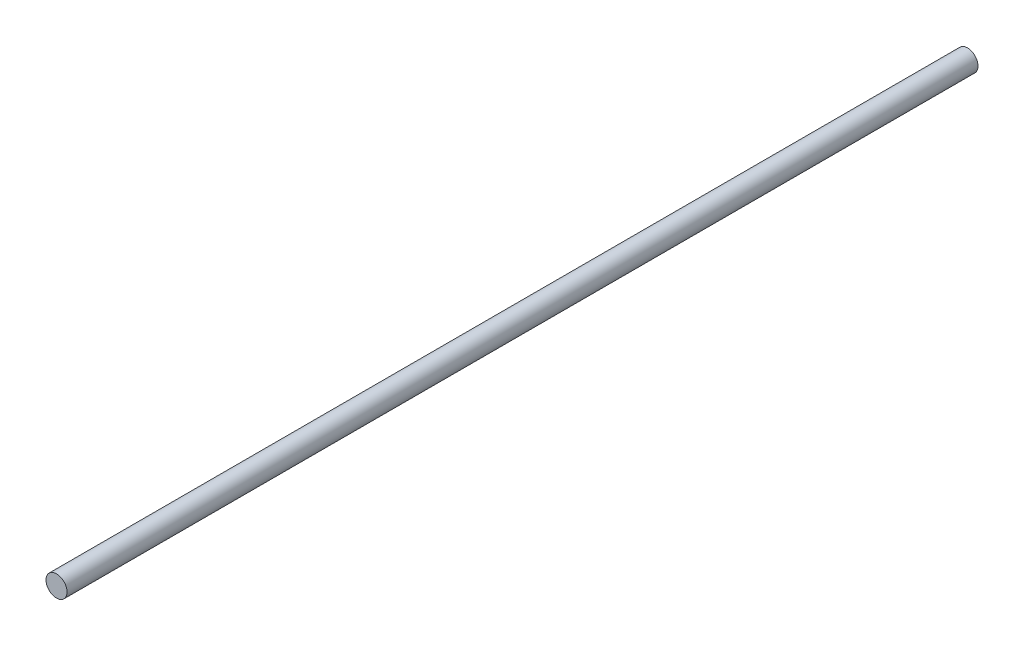
ISO-10303-21;
HEADER;
FILE_DESCRIPTION(('STEP AP214'),'2;1');
FILE_NAME('part.step','',(''),(''),'','','');
FILE_SCHEMA(('AUTOMOTIVE_DESIGN { 1 0 10303 214 1 1 1 1 }'));
ENDSEC;
DATA;
#1=APPLICATION_CONTEXT('core data for automotive mechanical design processes');
#2=APPLICATION_PROTOCOL_DEFINITION('international standard','automotive_design',2000,#1);
#3=PRODUCT_CONTEXT('',#1,'mechanical');
#4=PRODUCT('Part','Part','',(#3));
#5=PRODUCT_RELATED_PRODUCT_CATEGORY('part','',(#4));
#6=PRODUCT_DEFINITION_FORMATION('','',#4);
#7=PRODUCT_DEFINITION_CONTEXT('part definition',#1,'design');
#8=PRODUCT_DEFINITION('design','',#6,#7);
#9=PRODUCT_DEFINITION_SHAPE('','',#8);
#10=(LENGTH_UNIT() NAMED_UNIT(*) SI_UNIT(.MILLI.,.METRE.));
#11=(NAMED_UNIT(*) PLANE_ANGLE_UNIT() SI_UNIT($,.RADIAN.));
#12=(NAMED_UNIT(*) SI_UNIT($,.STERADIAN.) SOLID_ANGLE_UNIT());
#13=UNCERTAINTY_MEASURE_WITH_UNIT(LENGTH_MEASURE(1.E-05),#10,'distance_accuracy_value','');
#14=(GEOMETRIC_REPRESENTATION_CONTEXT(3) GLOBAL_UNCERTAINTY_ASSIGNED_CONTEXT((#13)) GLOBAL_UNIT_ASSIGNED_CONTEXT((#10,
#11,#12)) REPRESENTATION_CONTEXT('',''));
#15=CARTESIAN_POINT('',(0.,0.,0.));
#16=DIRECTION('',(0.,0.,1.));
#17=DIRECTION('',(1.,0.,0.));
#18=AXIS2_PLACEMENT_3D('',#15,#16,#17);
#19=CARTESIAN_POINT('',(0.,0.,173.));
#20=DIRECTION('',(0.,0.,-1.));
#21=DIRECTION('',(-1.,0.,0.));
#22=AXIS2_PLACEMENT_3D('',#19,#20,#21);
#23=CYLINDRICAL_SURFACE('',#22,2.);
#24=CARTESIAN_POINT('',(0.,0.,173.));
#25=DIRECTION('',(0.,0.,1.));
#26=DIRECTION('',(1.,0.,0.));
#27=AXIS2_PLACEMENT_3D('',#24,#25,#26);
#28=CIRCLE('',#27,2.);
#29=CARTESIAN_POINT('',(2.,0.,173.));
#30=VERTEX_POINT('',#29);
#31=EDGE_CURVE('E10',#30,#30,#28,.T.);
#32=ORIENTED_EDGE('',*,*,#31,.F.);
#33=EDGE_LOOP('',(#32));
#34=FACE_BOUND('',#33,.T.);
#35=CARTESIAN_POINT('',(0.,0.,0.));
#36=DIRECTION('',(0.,0.,1.));
#37=DIRECTION('',(1.,0.,0.));
#38=AXIS2_PLACEMENT_3D('',#35,#36,#37);
#39=CIRCLE('',#38,2.);
#40=CARTESIAN_POINT('',(2.,0.,0.));
#41=VERTEX_POINT('',#40);
#42=EDGE_CURVE('E40',#41,#41,#39,.T.);
#43=ORIENTED_EDGE('',*,*,#42,.T.);
#44=EDGE_LOOP('',(#43));
#45=FACE_BOUND('',#44,.T.);
#46=ADVANCED_FACE('F37',(#34,#45),#23,.T.);
#47=CARTESIAN_POINT('',(0.,0.,173.));
#48=DIRECTION('',(0.,0.,1.));
#49=DIRECTION('',(1.,0.,0.));
#50=AXIS2_PLACEMENT_3D('',#47,#48,#49);
#51=PLANE('',#50);
#52=ORIENTED_EDGE('',*,*,#31,.T.);
#53=EDGE_LOOP('',(#52));
#54=FACE_BOUND('',#53,.T.);
#55=ADVANCED_FACE('F54',(#54),#51,.T.);
#56=CARTESIAN_POINT('',(0.,0.,0.));
#57=DIRECTION('',(0.,0.,1.));
#58=DIRECTION('',(1.,0.,0.));
#59=AXIS2_PLACEMENT_3D('',#56,#57,#58);
#60=PLANE('',#59);
#61=ORIENTED_EDGE('',*,*,#42,.F.);
#62=EDGE_LOOP('',(#61));
#63=FACE_BOUND('',#62,.T.);
#64=ADVANCED_FACE('F52',(#63),#60,.F.);
#65=CLOSED_SHELL('',(#46,#55,#64));
#66=MANIFOLD_SOLID_BREP('B2',#65);
#67=ADVANCED_BREP_SHAPE_REPRESENTATION('',(#18,#66),#14);
#68=SHAPE_DEFINITION_REPRESENTATION(#9,#67);
ENDSEC;
END-ISO-10303-21;
